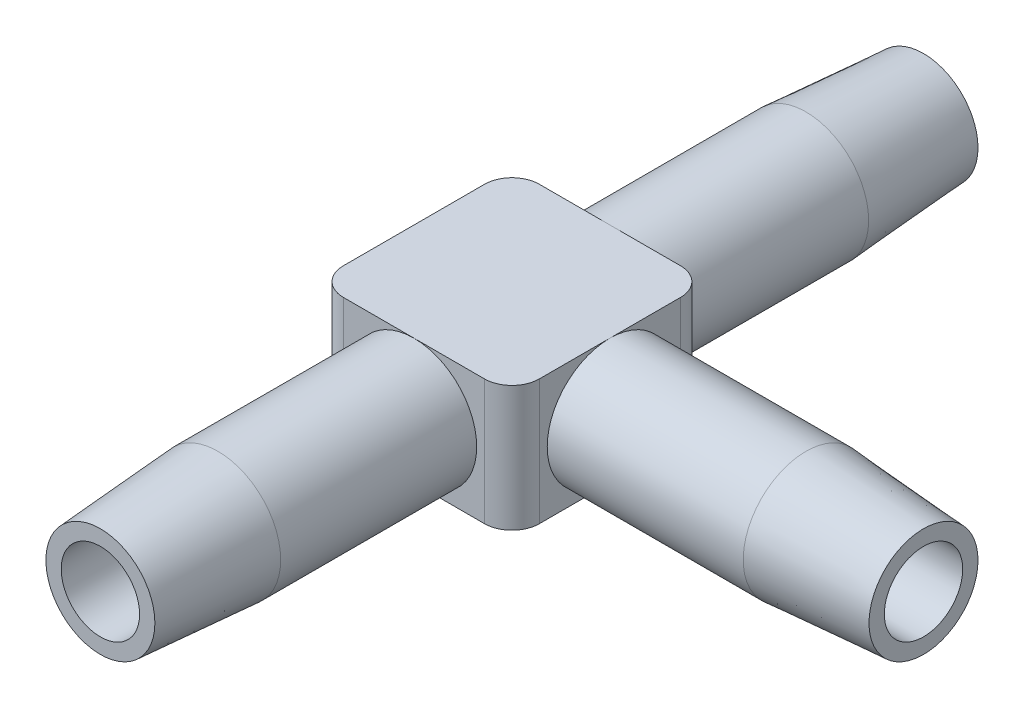
ISO-10303-21;
HEADER;
FILE_DESCRIPTION(('STEP AP214'),'2;1');
FILE_NAME('part.step','',(''),(''),'','','');
FILE_SCHEMA(('AUTOMOTIVE_DESIGN { 1 0 10303 214 1 1 1 1 }'));
ENDSEC;
DATA;
#1=APPLICATION_CONTEXT('core data for automotive mechanical design processes');
#2=APPLICATION_PROTOCOL_DEFINITION('international standard','automotive_design',2000,#1);
#3=PRODUCT_CONTEXT('',#1,'mechanical');
#4=PRODUCT('Part','Part','',(#3));
#5=PRODUCT_RELATED_PRODUCT_CATEGORY('part','',(#4));
#6=PRODUCT_DEFINITION_FORMATION('','',#4);
#7=PRODUCT_DEFINITION_CONTEXT('part definition',#1,'design');
#8=PRODUCT_DEFINITION('design','',#6,#7);
#9=PRODUCT_DEFINITION_SHAPE('','',#8);
#10=(LENGTH_UNIT() NAMED_UNIT(*) SI_UNIT(.MILLI.,.METRE.));
#11=(NAMED_UNIT(*) PLANE_ANGLE_UNIT() SI_UNIT($,.RADIAN.));
#12=(NAMED_UNIT(*) SI_UNIT($,.STERADIAN.) SOLID_ANGLE_UNIT());
#13=UNCERTAINTY_MEASURE_WITH_UNIT(LENGTH_MEASURE(1.E-05),#10,'distance_accuracy_value','');
#14=(GEOMETRIC_REPRESENTATION_CONTEXT(3) GLOBAL_UNCERTAINTY_ASSIGNED_CONTEXT((#13)) GLOBAL_UNIT_ASSIGNED_CONTEXT((#10,
#11,#12)) REPRESENTATION_CONTEXT('',''));
#15=CARTESIAN_POINT('',(0.,0.,0.));
#16=DIRECTION('',(0.,0.,1.));
#17=DIRECTION('',(1.,0.,0.));
#18=AXIS2_PLACEMENT_3D('',#15,#16,#17);
#19=CARTESIAN_POINT('',(-5.,6.4,-5.));
#20=DIRECTION('',(0.,0.,1.));
#21=DIRECTION('',(1.,0.,0.));
#22=AXIS2_PLACEMENT_3D('',#19,#20,#21);
#23=PLANE('',#22);
#24=DIRECTION('',(-1.,0.,0.));
#25=VECTOR('',#24,1.);
#26=CARTESIAN_POINT('',(-5.,0.,-5.));
#27=LINE('',#26,#25);
#28=CARTESIAN_POINT('',(0.,0.,-5.));
#29=VERTEX_POINT('',#28);
#30=CARTESIAN_POINT('',(-3.6,0.,-5.));
#31=VERTEX_POINT('',#30);
#32=EDGE_CURVE('E216',#29,#31,#27,.T.);
#33=ORIENTED_EDGE('',*,*,#32,.T.);
#34=DIRECTION('',(0.,-1.,0.));
#35=VECTOR('',#34,1.);
#36=CARTESIAN_POINT('',(-3.6,6.4,-5.));
#37=LINE('',#36,#35);
#38=CARTESIAN_POINT('',(-3.6,6.4,-5.));
#39=VERTEX_POINT('',#38);
#40=EDGE_CURVE('E61',#31,#39,#37,.F.);
#41=ORIENTED_EDGE('',*,*,#40,.T.);
#42=DIRECTION('',(-1.,0.,0.));
#43=VECTOR('',#42,1.);
#44=CARTESIAN_POINT('',(-5.,6.4,-5.));
#45=LINE('',#44,#43);
#46=CARTESIAN_POINT('',(0.,6.4,-5.));
#47=VERTEX_POINT('',#46);
#48=EDGE_CURVE('E201',#47,#39,#45,.T.);
#49=ORIENTED_EDGE('',*,*,#48,.F.);
#50=CARTESIAN_POINT('',(0.,3.2,-5.));
#51=DIRECTION('',(0.,0.,1.));
#52=DIRECTION('',(1.,0.,0.));
#53=AXIS2_PLACEMENT_3D('',#50,#51,#52);
#54=CIRCLE('',#53,3.2);
#55=EDGE_CURVE('E156',#47,#29,#54,.T.);
#56=ORIENTED_EDGE('',*,*,#55,.T.);
#57=EDGE_LOOP('',(#33,#41,#49,#56));
#58=FACE_BOUND('',#57,.T.);
#59=ADVANCED_FACE('F38',(#58),#23,.F.);
#60=CARTESIAN_POINT('',(5.,6.4,-5.));
#61=DIRECTION('',(-1.,0.,0.));
#62=DIRECTION('',(0.,0.,1.));
#63=AXIS2_PLACEMENT_3D('',#60,#61,#62);
#64=PLANE('',#63);
#65=DIRECTION('',(0.,0.,-1.));
#66=VECTOR('',#65,1.);
#67=CARTESIAN_POINT('',(5.,6.4,-5.));
#68=LINE('',#67,#66);
#69=CARTESIAN_POINT('',(5.,6.4,3.6));
#70=VERTEX_POINT('',#69);
#71=CARTESIAN_POINT('',(5.,6.4,0.));
#72=VERTEX_POINT('',#71);
#73=EDGE_CURVE('E198',#70,#72,#68,.T.);
#74=ORIENTED_EDGE('',*,*,#73,.F.);
#75=DIRECTION('',(0.,-1.,0.));
#76=VECTOR('',#75,1.);
#77=CARTESIAN_POINT('',(5.,6.4,3.6));
#78=LINE('',#77,#76);
#79=CARTESIAN_POINT('',(5.,0.,3.6));
#80=VERTEX_POINT('',#79);
#81=EDGE_CURVE('E47',#70,#80,#78,.T.);
#82=ORIENTED_EDGE('',*,*,#81,.T.);
#83=DIRECTION('',(0.,0.,-1.));
#84=VECTOR('',#83,1.);
#85=CARTESIAN_POINT('',(5.,0.,-5.));
#86=LINE('',#85,#84);
#87=CARTESIAN_POINT('',(5.,0.,0.));
#88=VERTEX_POINT('',#87);
#89=EDGE_CURVE('E213',#80,#88,#86,.T.);
#90=ORIENTED_EDGE('',*,*,#89,.T.);
#91=CARTESIAN_POINT('',(5.,3.2,0.));
#92=DIRECTION('',(1.,0.,0.));
#93=DIRECTION('',(0.,0.,-1.));
#94=AXIS2_PLACEMENT_3D('',#91,#92,#93);
#95=CIRCLE('',#94,3.2);
#96=EDGE_CURVE('E169',#72,#88,#95,.T.);
#97=ORIENTED_EDGE('',*,*,#96,.F.);
#98=EDGE_LOOP('',(#74,#82,#90,#97));
#99=FACE_BOUND('',#98,.T.);
#100=ADVANCED_FACE('F268',(#99),#64,.F.);
#101=CARTESIAN_POINT('',(-5.,6.4,5.));
#102=DIRECTION('',(0.,0.,-1.));
#103=DIRECTION('',(-1.,0.,0.));
#104=AXIS2_PLACEMENT_3D('',#101,#102,#103);
#105=PLANE('',#104);
#106=DIRECTION('',(1.,0.,0.));
#107=VECTOR('',#106,1.);
#108=CARTESIAN_POINT('',(-5.,6.4,5.));
#109=LINE('',#108,#107);
#110=CARTESIAN_POINT('',(-3.6,6.4,5.));
#111=VERTEX_POINT('',#110);
#112=CARTESIAN_POINT('',(0.,6.4,5.));
#113=VERTEX_POINT('',#112);
#114=EDGE_CURVE('E194',#111,#113,#109,.T.);
#115=ORIENTED_EDGE('',*,*,#114,.F.);
#116=DIRECTION('',(0.,-1.,0.));
#117=VECTOR('',#116,1.);
#118=CARTESIAN_POINT('',(-3.6,6.4,5.));
#119=LINE('',#118,#117);
#120=CARTESIAN_POINT('',(-3.6,0.,5.));
#121=VERTEX_POINT('',#120);
#122=EDGE_CURVE('E219',#111,#121,#119,.T.);
#123=ORIENTED_EDGE('',*,*,#122,.T.);
#124=DIRECTION('',(1.,0.,0.));
#125=VECTOR('',#124,1.);
#126=CARTESIAN_POINT('',(-5.,0.,5.));
#127=LINE('',#126,#125);
#128=CARTESIAN_POINT('',(0.,0.,5.));
#129=VERTEX_POINT('',#128);
#130=EDGE_CURVE('E209',#121,#129,#127,.T.);
#131=ORIENTED_EDGE('',*,*,#130,.T.);
#132=CARTESIAN_POINT('',(0.,3.2,5.));
#133=DIRECTION('',(0.,0.,1.));
#134=DIRECTION('',(1.,0.,0.));
#135=AXIS2_PLACEMENT_3D('',#132,#133,#134);
#136=CIRCLE('',#135,3.2);
#137=EDGE_CURVE('E174',#113,#129,#136,.T.);
#138=ORIENTED_EDGE('',*,*,#137,.F.);
#139=EDGE_LOOP('',(#115,#123,#131,#138));
#140=FACE_BOUND('',#139,.T.);
#141=ADVANCED_FACE('F328',(#140),#105,.F.);
#142=CARTESIAN_POINT('',(-5.,6.4,-5.));
#143=DIRECTION('',(1.,0.,0.));
#144=DIRECTION('',(0.,0.,-1.));
#145=AXIS2_PLACEMENT_3D('',#142,#143,#144);
#146=PLANE('',#145);
#147=DIRECTION('',(0.,0.,1.));
#148=VECTOR('',#147,1.);
#149=CARTESIAN_POINT('',(-5.,0.,-5.));
#150=LINE('',#149,#148);
#151=CARTESIAN_POINT('',(-5.,0.,-3.6));
#152=VERTEX_POINT('',#151);
#153=CARTESIAN_POINT('',(-5.,0.,3.6));
#154=VERTEX_POINT('',#153);
#155=EDGE_CURVE('E183',#152,#154,#150,.T.);
#156=ORIENTED_EDGE('',*,*,#155,.T.);
#157=DIRECTION('',(0.,-1.,0.));
#158=VECTOR('',#157,1.);
#159=CARTESIAN_POINT('',(-5.,6.4,3.6));
#160=LINE('',#159,#158);
#161=CARTESIAN_POINT('',(-5.,6.4,3.6));
#162=VERTEX_POINT('',#161);
#163=EDGE_CURVE('E239',#154,#162,#160,.F.);
#164=ORIENTED_EDGE('',*,*,#163,.T.);
#165=DIRECTION('',(0.,0.,1.));
#166=VECTOR('',#165,1.);
#167=CARTESIAN_POINT('',(-5.,6.4,-5.));
#168=LINE('',#167,#166);
#169=CARTESIAN_POINT('',(-5.,6.4,-3.6));
#170=VERTEX_POINT('',#169);
#171=EDGE_CURVE('E188',#170,#162,#168,.T.);
#172=ORIENTED_EDGE('',*,*,#171,.F.);
#173=DIRECTION('',(0.,-1.,0.));
#174=VECTOR('',#173,1.);
#175=CARTESIAN_POINT('',(-5.,6.4,-3.6));
#176=LINE('',#175,#174);
#177=EDGE_CURVE('E235',#170,#152,#176,.T.);
#178=ORIENTED_EDGE('',*,*,#177,.T.);
#179=EDGE_LOOP('',(#156,#164,#172,#178));
#180=FACE_BOUND('',#179,.T.);
#181=ADVANCED_FACE('F319',(#180),#146,.F.);
#182=CARTESIAN_POINT('',(3.6,0.,5.));
#183=VERTEX_POINT('',#182);
#184=EDGE_CURVE('E208',#129,#183,#127,.T.);
#185=ORIENTED_EDGE('',*,*,#184,.T.);
#186=DIRECTION('',(0.,-1.,0.));
#187=VECTOR('',#186,1.);
#188=CARTESIAN_POINT('',(3.6,6.4,5.));
#189=LINE('',#188,#187);
#190=CARTESIAN_POINT('',(3.6,6.4,5.));
#191=VERTEX_POINT('',#190);
#192=EDGE_CURVE('E11',#183,#191,#189,.F.);
#193=ORIENTED_EDGE('',*,*,#192,.T.);
#194=EDGE_CURVE('E192',#113,#191,#109,.T.);
#195=ORIENTED_EDGE('',*,*,#194,.F.);
#196=EDGE_CURVE('E187',#129,#113,#136,.T.);
#197=ORIENTED_EDGE('',*,*,#196,.F.);
#198=EDGE_LOOP('',(#185,#193,#195,#197));
#199=FACE_BOUND('',#198,.T.);
#200=ADVANCED_FACE('F299',(#199),#105,.F.);
#201=CARTESIAN_POINT('',(5.,0.,-3.6));
#202=VERTEX_POINT('',#201);
#203=EDGE_CURVE('E212',#88,#202,#86,.T.);
#204=ORIENTED_EDGE('',*,*,#203,.T.);
#205=DIRECTION('',(0.,-1.,0.));
#206=VECTOR('',#205,1.);
#207=CARTESIAN_POINT('',(5.,6.4,-3.6));
#208=LINE('',#207,#206);
#209=CARTESIAN_POINT('',(5.,6.4,-3.6));
#210=VERTEX_POINT('',#209);
#211=EDGE_CURVE('E260',#202,#210,#208,.F.);
#212=ORIENTED_EDGE('',*,*,#211,.T.);
#213=EDGE_CURVE('E197',#72,#210,#68,.T.);
#214=ORIENTED_EDGE('',*,*,#213,.F.);
#215=EDGE_CURVE('E178',#88,#72,#95,.T.);
#216=ORIENTED_EDGE('',*,*,#215,.F.);
#217=EDGE_LOOP('',(#204,#212,#214,#216));
#218=FACE_BOUND('',#217,.T.);
#219=ADVANCED_FACE('F344',(#218),#64,.F.);
#220=CARTESIAN_POINT('',(3.6,6.4,-5.));
#221=VERTEX_POINT('',#220);
#222=EDGE_CURVE('E202',#221,#47,#45,.T.);
#223=ORIENTED_EDGE('',*,*,#222,.F.);
#224=DIRECTION('',(0.,-1.,0.));
#225=VECTOR('',#224,1.);
#226=CARTESIAN_POINT('',(3.6,6.4,-5.));
#227=LINE('',#226,#225);
#228=CARTESIAN_POINT('',(3.6,0.,-5.));
#229=VERTEX_POINT('',#228);
#230=EDGE_CURVE('E256',#221,#229,#227,.T.);
#231=ORIENTED_EDGE('',*,*,#230,.T.);
#232=EDGE_CURVE('E193',#229,#29,#27,.T.);
#233=ORIENTED_EDGE('',*,*,#232,.T.);
#234=EDGE_CURVE('E161',#29,#47,#54,.T.);
#235=ORIENTED_EDGE('',*,*,#234,.T.);
#236=EDGE_LOOP('',(#223,#231,#233,#235));
#237=FACE_BOUND('',#236,.T.);
#238=ADVANCED_FACE('F339',(#237),#23,.F.);
#239=CARTESIAN_POINT('',(0.,6.4,0.));
#240=DIRECTION('',(0.,1.,0.));
#241=DIRECTION('',(0.,0.,1.));
#242=AXIS2_PLACEMENT_3D('',#239,#240,#241);
#243=PLANE('',#242);
#244=ORIENTED_EDGE('',*,*,#171,.T.);
#245=CARTESIAN_POINT('',(-3.6,6.4,3.6));
#246=DIRECTION('',(0.,1.,0.));
#247=DIRECTION('',(0.,0.,1.));
#248=AXIS2_PLACEMENT_3D('',#245,#246,#247);
#249=CIRCLE('',#248,1.4);
#250=EDGE_CURVE('E251',#162,#111,#249,.T.);
#251=ORIENTED_EDGE('',*,*,#250,.T.);
#252=ORIENTED_EDGE('',*,*,#114,.T.);
#253=ORIENTED_EDGE('',*,*,#194,.T.);
#254=CARTESIAN_POINT('',(3.6,6.4,3.6));
#255=DIRECTION('',(0.,1.,0.));
#256=DIRECTION('',(0.,0.,1.));
#257=AXIS2_PLACEMENT_3D('',#254,#255,#256);
#258=CIRCLE('',#257,1.4);
#259=EDGE_CURVE('E242',#191,#70,#258,.T.);
#260=ORIENTED_EDGE('',*,*,#259,.T.);
#261=ORIENTED_EDGE('',*,*,#73,.T.);
#262=ORIENTED_EDGE('',*,*,#213,.T.);
#263=CARTESIAN_POINT('',(3.6,6.4,-3.6));
#264=DIRECTION('',(0.,1.,0.));
#265=DIRECTION('',(0.,0.,1.));
#266=AXIS2_PLACEMENT_3D('',#263,#264,#265);
#267=CIRCLE('',#266,1.4);
#268=EDGE_CURVE('E245',#210,#221,#267,.T.);
#269=ORIENTED_EDGE('',*,*,#268,.T.);
#270=ORIENTED_EDGE('',*,*,#222,.T.);
#271=ORIENTED_EDGE('',*,*,#48,.T.);
#272=CARTESIAN_POINT('',(-3.6,6.4,-3.6));
#273=DIRECTION('',(0.,1.,0.));
#274=DIRECTION('',(0.,0.,1.));
#275=AXIS2_PLACEMENT_3D('',#272,#273,#274);
#276=CIRCLE('',#275,1.4);
#277=EDGE_CURVE('E248',#39,#170,#276,.T.);
#278=ORIENTED_EDGE('',*,*,#277,.T.);
#279=EDGE_LOOP('',(#244,#251,#252,#253,#260,#261,#262,#269,#270,#271,#278));
#280=FACE_BOUND('',#279,.T.);
#281=ADVANCED_FACE('F310',(#280),#243,.T.);
#282=CARTESIAN_POINT('',(0.,0.,0.));
#283=DIRECTION('',(0.,1.,0.));
#284=DIRECTION('',(0.,0.,1.));
#285=AXIS2_PLACEMENT_3D('',#282,#283,#284);
#286=PLANE('',#285);
#287=ORIENTED_EDGE('',*,*,#130,.F.);
#288=CARTESIAN_POINT('',(-3.6,0.,3.6));
#289=DIRECTION('',(0.,1.,0.));
#290=DIRECTION('',(0.,0.,1.));
#291=AXIS2_PLACEMENT_3D('',#288,#289,#290);
#292=CIRCLE('',#291,1.4);
#293=EDGE_CURVE('E232',#121,#154,#292,.F.);
#294=ORIENTED_EDGE('',*,*,#293,.T.);
#295=ORIENTED_EDGE('',*,*,#155,.F.);
#296=CARTESIAN_POINT('',(-3.6,0.,-3.6));
#297=DIRECTION('',(0.,1.,0.));
#298=DIRECTION('',(0.,0.,1.));
#299=AXIS2_PLACEMENT_3D('',#296,#297,#298);
#300=CIRCLE('',#299,1.4);
#301=EDGE_CURVE('E229',#152,#31,#300,.F.);
#302=ORIENTED_EDGE('',*,*,#301,.T.);
#303=ORIENTED_EDGE('',*,*,#32,.F.);
#304=ORIENTED_EDGE('',*,*,#232,.F.);
#305=CARTESIAN_POINT('',(3.6,0.,-3.6));
#306=DIRECTION('',(0.,1.,0.));
#307=DIRECTION('',(0.,0.,1.));
#308=AXIS2_PLACEMENT_3D('',#305,#306,#307);
#309=CIRCLE('',#308,1.4);
#310=EDGE_CURVE('E226',#229,#202,#309,.F.);
#311=ORIENTED_EDGE('',*,*,#310,.T.);
#312=ORIENTED_EDGE('',*,*,#203,.F.);
#313=ORIENTED_EDGE('',*,*,#89,.F.);
#314=CARTESIAN_POINT('',(3.6,0.,3.6));
#315=DIRECTION('',(0.,1.,0.));
#316=DIRECTION('',(0.,0.,1.));
#317=AXIS2_PLACEMENT_3D('',#314,#315,#316);
#318=CIRCLE('',#317,1.4);
#319=EDGE_CURVE('E223',#80,#183,#318,.F.);
#320=ORIENTED_EDGE('',*,*,#319,.T.);
#321=ORIENTED_EDGE('',*,*,#184,.F.);
#322=EDGE_LOOP('',(#287,#294,#295,#302,#303,#304,#311,#312,#313,#320,#321));
#323=FACE_BOUND('',#322,.T.);
#324=ADVANCED_FACE('F276',(#323),#286,.F.);
#325=CARTESIAN_POINT('',(0.,3.2,15.));
#326=DIRECTION('',(0.,0.,-1.));
#327=DIRECTION('',(-1.,0.,0.));
#328=AXIS2_PLACEMENT_3D('',#325,#326,#327);
#329=CYLINDRICAL_SURFACE('',#328,3.2);
#330=CARTESIAN_POINT('',(0.,3.2,15.));
#331=DIRECTION('',(0.,0.,1.));
#332=DIRECTION('',(1.,0.,0.));
#333=AXIS2_PLACEMENT_3D('',#330,#331,#332);
#334=CIRCLE('',#333,3.2);
#335=CARTESIAN_POINT('',(3.2,3.2,15.));
#336=VERTEX_POINT('',#335);
#337=EDGE_CURVE('E179',#336,#336,#334,.T.);
#338=ORIENTED_EDGE('',*,*,#337,.F.);
#339=EDGE_LOOP('',(#338));
#340=FACE_BOUND('',#339,.T.);
#341=ORIENTED_EDGE('',*,*,#137,.T.);
#342=ORIENTED_EDGE('',*,*,#196,.T.);
#343=EDGE_LOOP('',(#341,#342));
#344=FACE_BOUND('',#343,.T.);
#345=ADVANCED_FACE('F295',(#340,#344),#329,.T.);
#346=CARTESIAN_POINT('',(15.,3.2,0.));
#347=DIRECTION('',(-1.,0.,0.));
#348=DIRECTION('',(0.,0.,1.));
#349=AXIS2_PLACEMENT_3D('',#346,#347,#348);
#350=CYLINDRICAL_SURFACE('',#349,3.2);
#351=CARTESIAN_POINT('',(15.,3.2,0.));
#352=DIRECTION('',(1.,0.,0.));
#353=DIRECTION('',(0.,0.,-1.));
#354=AXIS2_PLACEMENT_3D('',#351,#352,#353);
#355=CIRCLE('',#354,3.2);
#356=CARTESIAN_POINT('',(15.,3.2,-3.2));
#357=VERTEX_POINT('',#356);
#358=EDGE_CURVE('E170',#357,#357,#355,.T.);
#359=ORIENTED_EDGE('',*,*,#358,.F.);
#360=EDGE_LOOP('',(#359));
#361=FACE_BOUND('',#360,.T.);
#362=ORIENTED_EDGE('',*,*,#96,.T.);
#363=ORIENTED_EDGE('',*,*,#215,.T.);
#364=EDGE_LOOP('',(#362,#363));
#365=FACE_BOUND('',#364,.T.);
#366=ADVANCED_FACE('F286',(#361,#365),#350,.T.);
#367=CARTESIAN_POINT('',(15.,3.2,0.));
#368=DIRECTION('',(-1.,0.,0.));
#369=DIRECTION('',(0.,0.,-1.));
#370=AXIS2_PLACEMENT_3D('',#367,#368,#369);
#371=CONICAL_SURFACE('',#370,3.2,0.0698131700797732);
#372=CARTESIAN_POINT('',(21.,3.2,0.));
#373=DIRECTION('',(1.,0.,0.));
#374=DIRECTION('',(0.,0.,-1.));
#375=AXIS2_PLACEMENT_3D('',#372,#373,#374);
#376=CIRCLE('',#375,2.78043912833894);
#377=CARTESIAN_POINT('',(21.,3.2,-2.78043912833894));
#378=VERTEX_POINT('',#377);
#379=EDGE_CURVE('E165',#378,#378,#376,.T.);
#380=ORIENTED_EDGE('',*,*,#379,.F.);
#381=EDGE_LOOP('',(#380));
#382=FACE_BOUND('',#381,.T.);
#383=ORIENTED_EDGE('',*,*,#358,.T.);
#384=EDGE_LOOP('',(#383));
#385=FACE_BOUND('',#384,.T.);
#386=ADVANCED_FACE('F382',(#382,#385),#371,.T.);
#387=CARTESIAN_POINT('',(21.,3.2,0.));
#388=DIRECTION('',(1.,0.,0.));
#389=DIRECTION('',(0.,0.,-1.));
#390=AXIS2_PLACEMENT_3D('',#387,#388,#389);
#391=PLANE('',#390);
#392=CARTESIAN_POINT('',(21.,3.2,0.));
#393=DIRECTION('',(1.,0.,0.));
#394=DIRECTION('',(0.,0.,-1.));
#395=AXIS2_PLACEMENT_3D('',#392,#393,#394);
#396=CIRCLE('',#395,2.);
#397=CARTESIAN_POINT('',(21.,3.2,-2.));
#398=VERTEX_POINT('',#397);
#399=EDGE_CURVE('E134',#398,#398,#396,.T.);
#400=ORIENTED_EDGE('',*,*,#399,.F.);
#401=EDGE_LOOP('',(#400));
#402=FACE_BOUND('',#401,.T.);
#403=ORIENTED_EDGE('',*,*,#379,.T.);
#404=EDGE_LOOP('',(#403));
#405=FACE_BOUND('',#404,.T.);
#406=ADVANCED_FACE('F378',(#402,#405),#391,.T.);
#407=CARTESIAN_POINT('',(0.,3.2,15.));
#408=DIRECTION('',(0.,0.,-1.));
#409=DIRECTION('',(1.,0.,0.));
#410=AXIS2_PLACEMENT_3D('',#407,#408,#409);
#411=CONICAL_SURFACE('',#410,3.2,0.0698131700797732);
#412=CARTESIAN_POINT('',(0.,3.2,21.));
#413=DIRECTION('',(0.,0.,1.));
#414=DIRECTION('',(1.,0.,0.));
#415=AXIS2_PLACEMENT_3D('',#412,#413,#414);
#416=CIRCLE('',#415,2.78043912833894);
#417=CARTESIAN_POINT('',(2.78043912833894,3.2,21.));
#418=VERTEX_POINT('',#417);
#419=EDGE_CURVE('E160',#418,#418,#416,.T.);
#420=ORIENTED_EDGE('',*,*,#419,.F.);
#421=EDGE_LOOP('',(#420));
#422=FACE_BOUND('',#421,.T.);
#423=ORIENTED_EDGE('',*,*,#337,.T.);
#424=EDGE_LOOP('',(#423));
#425=FACE_BOUND('',#424,.T.);
#426=ADVANCED_FACE('F371',(#422,#425),#411,.T.);
#427=CARTESIAN_POINT('',(0.,3.2,21.));
#428=DIRECTION('',(0.,0.,1.));
#429=DIRECTION('',(1.,0.,0.));
#430=AXIS2_PLACEMENT_3D('',#427,#428,#429);
#431=PLANE('',#430);
#432=CARTESIAN_POINT('',(0.,3.2,21.));
#433=DIRECTION('',(0.,0.,1.));
#434=DIRECTION('',(1.,0.,0.));
#435=AXIS2_PLACEMENT_3D('',#432,#433,#434);
#436=CIRCLE('',#435,2.);
#437=CARTESIAN_POINT('',(2.,3.2,21.));
#438=VERTEX_POINT('',#437);
#439=EDGE_CURVE('E138',#438,#438,#436,.T.);
#440=ORIENTED_EDGE('',*,*,#439,.F.);
#441=EDGE_LOOP('',(#440));
#442=FACE_BOUND('',#441,.T.);
#443=ORIENTED_EDGE('',*,*,#419,.T.);
#444=EDGE_LOOP('',(#443));
#445=FACE_BOUND('',#444,.T.);
#446=ADVANCED_FACE('F360',(#442,#445),#431,.T.);
#447=CARTESIAN_POINT('',(0.,3.2,-15.));
#448=DIRECTION('',(0.,0.,1.));
#449=DIRECTION('',(1.,0.,0.));
#450=AXIS2_PLACEMENT_3D('',#447,#448,#449);
#451=CYLINDRICAL_SURFACE('',#450,3.2);
#452=CARTESIAN_POINT('',(0.,3.2,-15.));
#453=DIRECTION('',(0.,0.,1.));
#454=DIRECTION('',(1.,0.,0.));
#455=AXIS2_PLACEMENT_3D('',#452,#453,#454);
#456=CIRCLE('',#455,3.2);
#457=CARTESIAN_POINT('',(3.2,3.2,-15.));
#458=VERTEX_POINT('',#457);
#459=EDGE_CURVE('E145',#458,#458,#456,.T.);
#460=ORIENTED_EDGE('',*,*,#459,.T.);
#461=EDGE_LOOP('',(#460));
#462=FACE_BOUND('',#461,.T.);
#463=ORIENTED_EDGE('',*,*,#55,.F.);
#464=ORIENTED_EDGE('',*,*,#234,.F.);
#465=EDGE_LOOP('',(#463,#464));
#466=FACE_BOUND('',#465,.T.);
#467=ADVANCED_FACE('F357',(#462,#466),#451,.T.);
#468=CARTESIAN_POINT('',(0.,3.2,-15.));
#469=DIRECTION('',(0.,0.,1.));
#470=DIRECTION('',(1.,0.,0.));
#471=AXIS2_PLACEMENT_3D('',#468,#469,#470);
#472=CONICAL_SURFACE('',#471,3.2,0.0698131700797732);
#473=CARTESIAN_POINT('',(0.,3.2,-21.));
#474=DIRECTION('',(0.,0.,-1.));
#475=DIRECTION('',(-1.,0.,0.));
#476=AXIS2_PLACEMENT_3D('',#473,#474,#475);
#477=CIRCLE('',#476,2.78043912833894);
#478=CARTESIAN_POINT('',(-2.78043912833894,3.2,-21.));
#479=VERTEX_POINT('',#478);
#480=EDGE_CURVE('E152',#479,#479,#477,.F.);
#481=ORIENTED_EDGE('',*,*,#480,.T.);
#482=EDGE_LOOP('',(#481));
#483=FACE_BOUND('',#482,.T.);
#484=ORIENTED_EDGE('',*,*,#459,.F.);
#485=EDGE_LOOP('',(#484));
#486=FACE_BOUND('',#485,.T.);
#487=ADVANCED_FACE('F359',(#483,#486),#472,.T.);
#488=CARTESIAN_POINT('',(0.,3.2,-21.));
#489=DIRECTION('',(0.,0.,-1.));
#490=DIRECTION('',(1.,0.,0.));
#491=AXIS2_PLACEMENT_3D('',#488,#489,#490);
#492=PLANE('',#491);
#493=CARTESIAN_POINT('',(0.,3.2,-21.));
#494=DIRECTION('',(0.,0.,1.));
#495=DIRECTION('',(1.,0.,0.));
#496=AXIS2_PLACEMENT_3D('',#493,#494,#495);
#497=CIRCLE('',#496,2.);
#498=CARTESIAN_POINT('',(2.,3.2,-21.));
#499=VERTEX_POINT('',#498);
#500=EDGE_CURVE('E141',#499,#499,#497,.T.);
#501=ORIENTED_EDGE('',*,*,#500,.T.);
#502=EDGE_LOOP('',(#501));
#503=FACE_BOUND('',#502,.T.);
#504=ORIENTED_EDGE('',*,*,#480,.F.);
#505=EDGE_LOOP('',(#504));
#506=FACE_BOUND('',#505,.T.);
#507=ADVANCED_FACE('F367',(#503,#506),#492,.T.);
#508=CARTESIAN_POINT('',(-3.6,6.4,3.6));
#509=DIRECTION('',(0.,-1.,0.));
#510=DIRECTION('',(0.,0.,-1.));
#511=AXIS2_PLACEMENT_3D('',#508,#509,#510);
#512=CYLINDRICAL_SURFACE('',#511,1.4);
#513=ORIENTED_EDGE('',*,*,#250,.F.);
#514=ORIENTED_EDGE('',*,*,#163,.F.);
#515=ORIENTED_EDGE('',*,*,#293,.F.);
#516=ORIENTED_EDGE('',*,*,#122,.F.);
#517=EDGE_LOOP('',(#513,#514,#515,#516));
#518=FACE_BOUND('',#517,.T.);
#519=ADVANCED_FACE('F325',(#518),#512,.T.);
#520=CARTESIAN_POINT('',(-3.6,6.4,-3.6));
#521=DIRECTION('',(0.,-1.,0.));
#522=DIRECTION('',(0.,0.,-1.));
#523=AXIS2_PLACEMENT_3D('',#520,#521,#522);
#524=CYLINDRICAL_SURFACE('',#523,1.4);
#525=ORIENTED_EDGE('',*,*,#277,.F.);
#526=ORIENTED_EDGE('',*,*,#40,.F.);
#527=ORIENTED_EDGE('',*,*,#301,.F.);
#528=ORIENTED_EDGE('',*,*,#177,.F.);
#529=EDGE_LOOP('',(#525,#526,#527,#528));
#530=FACE_BOUND('',#529,.T.);
#531=ADVANCED_FACE('F316',(#530),#524,.T.);
#532=CARTESIAN_POINT('',(3.6,6.4,-3.6));
#533=DIRECTION('',(0.,-1.,0.));
#534=DIRECTION('',(0.,0.,-1.));
#535=AXIS2_PLACEMENT_3D('',#532,#533,#534);
#536=CYLINDRICAL_SURFACE('',#535,1.4);
#537=ORIENTED_EDGE('',*,*,#268,.F.);
#538=ORIENTED_EDGE('',*,*,#211,.F.);
#539=ORIENTED_EDGE('',*,*,#310,.F.);
#540=ORIENTED_EDGE('',*,*,#230,.F.);
#541=EDGE_LOOP('',(#537,#538,#539,#540));
#542=FACE_BOUND('',#541,.T.);
#543=ADVANCED_FACE('F330',(#542),#536,.T.);
#544=CARTESIAN_POINT('',(3.6,6.4,3.6));
#545=DIRECTION('',(0.,-1.,0.));
#546=DIRECTION('',(0.,0.,-1.));
#547=AXIS2_PLACEMENT_3D('',#544,#545,#546);
#548=CYLINDRICAL_SURFACE('',#547,1.4);
#549=ORIENTED_EDGE('',*,*,#259,.F.);
#550=ORIENTED_EDGE('',*,*,#192,.F.);
#551=ORIENTED_EDGE('',*,*,#319,.F.);
#552=ORIENTED_EDGE('',*,*,#81,.F.);
#553=EDGE_LOOP('',(#549,#550,#551,#552));
#554=FACE_BOUND('',#553,.T.);
#555=ADVANCED_FACE('F40',(#554),#548,.T.);
#556=CARTESIAN_POINT('',(0.,3.2,-21.));
#557=DIRECTION('',(0.,0.,1.));
#558=DIRECTION('',(1.,0.,0.));
#559=AXIS2_PLACEMENT_3D('',#556,#557,#558);
#560=CYLINDRICAL_SURFACE('',#559,2.);
#561=CARTESIAN_POINT('',(0.,3.2,0.));
#562=DIRECTION('',(0.707106781186547,0.,-0.707106781186547));
#563=DIRECTION('',(0.707106781186548,0.,0.707106781186547));
#564=AXIS2_PLACEMENT_3D('',#561,#562,#563);
#565=ELLIPSE('',#564,2.82842712474619,2.);
#566=CARTESIAN_POINT('',(0.,1.2,0.));
#567=VERTEX_POINT('',#566);
#568=CARTESIAN_POINT('',(0.,5.2,0.));
#569=VERTEX_POINT('',#568);
#570=EDGE_CURVE('E126',#567,#569,#565,.F.);
#571=ORIENTED_EDGE('',*,*,#570,.F.);
#572=CARTESIAN_POINT('',(0.,3.2,0.));
#573=DIRECTION('',(0.707106781186548,0.,0.707106781186547));
#574=DIRECTION('',(0.707106781186547,0.,-0.707106781186547));
#575=AXIS2_PLACEMENT_3D('',#572,#573,#574);
#576=ELLIPSE('',#575,2.82842712474619,2.);
#577=EDGE_CURVE('E53',#569,#567,#576,.F.);
#578=ORIENTED_EDGE('',*,*,#577,.F.);
#579=EDGE_LOOP('',(#571,#578));
#580=FACE_BOUND('',#579,.T.);
#581=ORIENTED_EDGE('',*,*,#500,.F.);
#582=EDGE_LOOP('',(#581));
#583=FACE_BOUND('',#582,.T.);
#584=ORIENTED_EDGE('',*,*,#439,.T.);
#585=EDGE_LOOP('',(#584));
#586=FACE_BOUND('',#585,.T.);
#587=ADVANCED_FACE('F131',(#580,#583,#586),#560,.F.);
#588=CARTESIAN_POINT('',(-5.00100000000001,3.2,0.));
#589=DIRECTION('',(1.,0.,0.));
#590=DIRECTION('',(0.,0.,-1.));
#591=AXIS2_PLACEMENT_3D('',#588,#589,#590);
#592=CYLINDRICAL_SURFACE('',#591,2.);
#593=ORIENTED_EDGE('',*,*,#399,.T.);
#594=EDGE_LOOP('',(#593));
#595=FACE_BOUND('',#594,.T.);
#596=ORIENTED_EDGE('',*,*,#577,.T.);
#597=ORIENTED_EDGE('',*,*,#570,.T.);
#598=EDGE_LOOP('',(#596,#597));
#599=FACE_BOUND('',#598,.T.);
#600=ADVANCED_FACE('F127',(#595,#599),#592,.F.);
#601=CLOSED_SHELL('',(#59,#100,#141,#181,#200,#219,#238,#281,#324,#345,#366,#386,#406,#426,#446,
#467,#487,#507,#519,#531,#543,#555,#587,#600));
#602=MANIFOLD_SOLID_BREP('B2',#601);
#603=ADVANCED_BREP_SHAPE_REPRESENTATION('',(#18,#602),#14);
#604=SHAPE_DEFINITION_REPRESENTATION(#9,#603);
ENDSEC;
END-ISO-10303-21;
